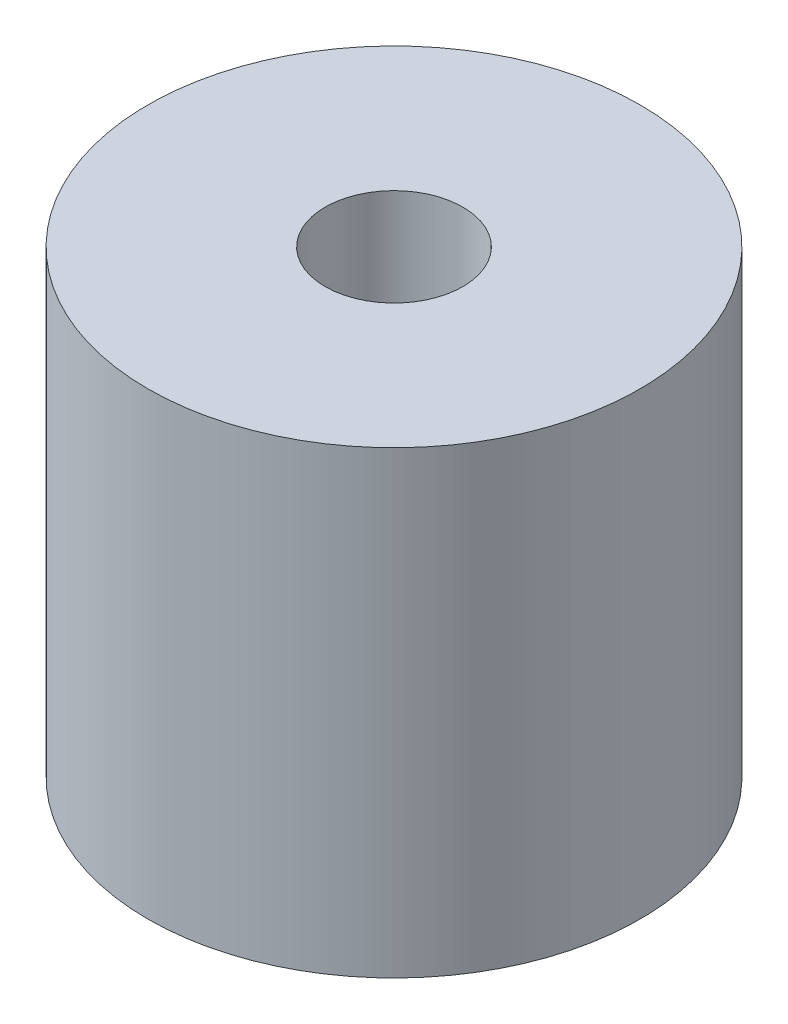
ISO-10303-21;
HEADER;
FILE_DESCRIPTION(('STEP AP214'),'2;1');
FILE_NAME('part.step','',(''),(''),'','','');
FILE_SCHEMA(('AUTOMOTIVE_DESIGN { 1 0 10303 214 1 1 1 1 }'));
ENDSEC;
DATA;
#1=APPLICATION_CONTEXT('core data for automotive mechanical design processes');
#2=APPLICATION_PROTOCOL_DEFINITION('international standard','automotive_design',2000,#1);
#3=PRODUCT_CONTEXT('',#1,'mechanical');
#4=PRODUCT('Part','Part','',(#3));
#5=PRODUCT_RELATED_PRODUCT_CATEGORY('part','',(#4));
#6=PRODUCT_DEFINITION_FORMATION('','',#4);
#7=PRODUCT_DEFINITION_CONTEXT('part definition',#1,'design');
#8=PRODUCT_DEFINITION('design','',#6,#7);
#9=PRODUCT_DEFINITION_SHAPE('','',#8);
#10=(LENGTH_UNIT() NAMED_UNIT(*) SI_UNIT(.MILLI.,.METRE.));
#11=(NAMED_UNIT(*) PLANE_ANGLE_UNIT() SI_UNIT($,.RADIAN.));
#12=(NAMED_UNIT(*) SI_UNIT($,.STERADIAN.) SOLID_ANGLE_UNIT());
#13=UNCERTAINTY_MEASURE_WITH_UNIT(LENGTH_MEASURE(1.E-05),#10,'distance_accuracy_value','');
#14=(GEOMETRIC_REPRESENTATION_CONTEXT(3) GLOBAL_UNCERTAINTY_ASSIGNED_CONTEXT((#13)) GLOBAL_UNIT_ASSIGNED_CONTEXT((#10,
#11,#12)) REPRESENTATION_CONTEXT('',''));
#15=CARTESIAN_POINT('',(0.,0.,0.));
#16=DIRECTION('',(0.,0.,1.));
#17=DIRECTION('',(1.,0.,0.));
#18=AXIS2_PLACEMENT_3D('',#15,#16,#17);
#19=CARTESIAN_POINT('',(0.,14.,0.));
#20=DIRECTION('',(0.,1.,0.));
#21=DIRECTION('',(0.,0.,1.));
#22=AXIS2_PLACEMENT_3D('',#19,#20,#21);
#23=PLANE('',#22);
#24=CARTESIAN_POINT('',(0.,14.,0.));
#25=DIRECTION('',(0.,1.,0.));
#26=DIRECTION('',(0.,0.,1.));
#27=AXIS2_PLACEMENT_3D('',#24,#25,#26);
#28=CIRCLE('',#27,7.5);
#29=CARTESIAN_POINT('',(0.,14.,7.5));
#30=VERTEX_POINT('',#29);
#31=EDGE_CURVE('E10',#30,#30,#28,.T.);
#32=ORIENTED_EDGE('',*,*,#31,.T.);
#33=EDGE_LOOP('',(#32));
#34=FACE_BOUND('',#33,.T.);
#35=CARTESIAN_POINT('',(0.,14.,0.));
#36=DIRECTION('',(0.,1.,0.));
#37=DIRECTION('',(0.,0.,1.));
#38=AXIS2_PLACEMENT_3D('',#35,#36,#37);
#39=CIRCLE('',#38,2.1);
#40=CARTESIAN_POINT('',(0.,14.,2.1));
#41=VERTEX_POINT('',#40);
#42=EDGE_CURVE('E42',#41,#41,#39,.T.);
#43=ORIENTED_EDGE('',*,*,#42,.F.);
#44=EDGE_LOOP('',(#43));
#45=FACE_BOUND('',#44,.T.);
#46=ADVANCED_FACE('F31',(#34,#45),#23,.T.);
#47=CARTESIAN_POINT('',(0.,0.,0.));
#48=DIRECTION('',(0.,1.,0.));
#49=DIRECTION('',(0.,0.,1.));
#50=AXIS2_PLACEMENT_3D('',#47,#48,#49);
#51=PLANE('',#50);
#52=CARTESIAN_POINT('',(0.,0.,0.));
#53=DIRECTION('',(0.,1.,0.));
#54=DIRECTION('',(0.,0.,1.));
#55=AXIS2_PLACEMENT_3D('',#52,#53,#54);
#56=CIRCLE('',#55,7.5);
#57=CARTESIAN_POINT('',(0.,0.,7.5));
#58=VERTEX_POINT('',#57);
#59=EDGE_CURVE('E35',#58,#58,#56,.T.);
#60=ORIENTED_EDGE('',*,*,#59,.F.);
#61=EDGE_LOOP('',(#60));
#62=FACE_BOUND('',#61,.T.);
#63=CARTESIAN_POINT('',(0.,0.,0.));
#64=DIRECTION('',(0.,1.,0.));
#65=DIRECTION('',(0.,0.,1.));
#66=AXIS2_PLACEMENT_3D('',#63,#64,#65);
#67=CIRCLE('',#66,2.1);
#68=CARTESIAN_POINT('',(0.,0.,2.1));
#69=VERTEX_POINT('',#68);
#70=EDGE_CURVE('E44',#69,#69,#67,.T.);
#71=ORIENTED_EDGE('',*,*,#70,.T.);
#72=EDGE_LOOP('',(#71));
#73=FACE_BOUND('',#72,.T.);
#74=ADVANCED_FACE('F54',(#62,#73),#51,.F.);
#75=CARTESIAN_POINT('',(0.,14.,0.));
#76=DIRECTION('',(0.,-1.,0.));
#77=DIRECTION('',(0.,0.,-1.));
#78=AXIS2_PLACEMENT_3D('',#75,#76,#77);
#79=CYLINDRICAL_SURFACE('',#78,7.5);
#80=ORIENTED_EDGE('',*,*,#31,.F.);
#81=EDGE_LOOP('',(#80));
#82=FACE_BOUND('',#81,.T.);
#83=ORIENTED_EDGE('',*,*,#59,.T.);
#84=EDGE_LOOP('',(#83));
#85=FACE_BOUND('',#84,.T.);
#86=ADVANCED_FACE('F33',(#82,#85),#79,.T.);
#87=CARTESIAN_POINT('',(0.,14.,0.));
#88=DIRECTION('',(0.,-1.,0.));
#89=DIRECTION('',(0.,0.,-1.));
#90=AXIS2_PLACEMENT_3D('',#87,#88,#89);
#91=CYLINDRICAL_SURFACE('',#90,2.1);
#92=ORIENTED_EDGE('',*,*,#42,.T.);
#93=EDGE_LOOP('',(#92));
#94=FACE_BOUND('',#93,.T.);
#95=ORIENTED_EDGE('',*,*,#70,.F.);
#96=EDGE_LOOP('',(#95));
#97=FACE_BOUND('',#96,.T.);
#98=ADVANCED_FACE('F50',(#94,#97),#91,.F.);
#99=CLOSED_SHELL('',(#46,#74,#86,#98));
#100=MANIFOLD_SOLID_BREP('B2',#99);
#101=ADVANCED_BREP_SHAPE_REPRESENTATION('',(#18,#100),#14);
#102=SHAPE_DEFINITION_REPRESENTATION(#9,#101);
ENDSEC;
END-ISO-10303-21;
